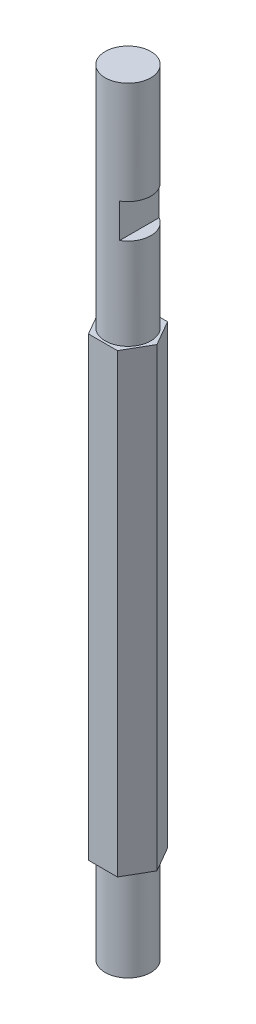
ISO-10303-21;
HEADER;
FILE_DESCRIPTION(('STEP AP214'),'2;1');
FILE_NAME('part.step','',(''),(''),'','','');
FILE_SCHEMA(('AUTOMOTIVE_DESIGN { 1 0 10303 214 1 1 1 1 }'));
ENDSEC;
DATA;
#1=APPLICATION_CONTEXT('core data for automotive mechanical design processes');
#2=APPLICATION_PROTOCOL_DEFINITION('international standard','automotive_design',2000,#1);
#3=PRODUCT_CONTEXT('',#1,'mechanical');
#4=PRODUCT('Part','Part','',(#3));
#5=PRODUCT_RELATED_PRODUCT_CATEGORY('part','',(#4));
#6=PRODUCT_DEFINITION_FORMATION('','',#4);
#7=PRODUCT_DEFINITION_CONTEXT('part definition',#1,'design');
#8=PRODUCT_DEFINITION('design','',#6,#7);
#9=PRODUCT_DEFINITION_SHAPE('','',#8);
#10=(LENGTH_UNIT() NAMED_UNIT(*) SI_UNIT(.MILLI.,.METRE.));
#11=(NAMED_UNIT(*) PLANE_ANGLE_UNIT() SI_UNIT($,.RADIAN.));
#12=(NAMED_UNIT(*) SI_UNIT($,.STERADIAN.) SOLID_ANGLE_UNIT());
#13=UNCERTAINTY_MEASURE_WITH_UNIT(LENGTH_MEASURE(1.E-05),#10,'distance_accuracy_value','');
#14=(GEOMETRIC_REPRESENTATION_CONTEXT(3) GLOBAL_UNCERTAINTY_ASSIGNED_CONTEXT((#13)) GLOBAL_UNIT_ASSIGNED_CONTEXT((#10,
#11,#12)) REPRESENTATION_CONTEXT('',''));
#15=CARTESIAN_POINT('',(0.,0.,0.));
#16=DIRECTION('',(0.,0.,1.));
#17=DIRECTION('',(1.,0.,0.));
#18=AXIS2_PLACEMENT_3D('',#15,#16,#17);
#19=CARTESIAN_POINT('',(0.,300.,0.));
#20=DIRECTION('',(0.,-1.,0.));
#21=DIRECTION('',(0.,0.,-1.));
#22=AXIS2_PLACEMENT_3D('',#19,#20,#21);
#23=CYLINDRICAL_SURFACE('',#22,10.);
#24=CARTESIAN_POINT('',(0.,200.,0.));
#25=DIRECTION('',(0.,1.,0.));
#26=DIRECTION('',(0.,0.,1.));
#27=AXIS2_PLACEMENT_3D('',#24,#25,#26);
#28=CIRCLE('',#27,10.);
#29=CARTESIAN_POINT('',(0.,200.,10.));
#30=VERTEX_POINT('',#29);
#31=EDGE_CURVE('E165',#30,#30,#28,.T.);
#32=ORIENTED_EDGE('',*,*,#31,.T.);
#33=EDGE_LOOP('',(#32));
#34=FACE_BOUND('',#33,.T.);
#35=CARTESIAN_POINT('',(0.,300.,0.));
#36=DIRECTION('',(0.,1.,0.));
#37=DIRECTION('',(0.,0.,1.));
#38=AXIS2_PLACEMENT_3D('',#35,#36,#37);
#39=CIRCLE('',#38,10.);
#40=CARTESIAN_POINT('',(0.,300.,10.));
#41=VERTEX_POINT('',#40);
#42=EDGE_CURVE('E164',#41,#41,#39,.T.);
#43=ORIENTED_EDGE('',*,*,#42,.F.);
#44=EDGE_LOOP('',(#43));
#45=FACE_BOUND('',#44,.T.);
#46=CARTESIAN_POINT('',(0.,255.,0.));
#47=DIRECTION('',(0.,-1.,0.));
#48=DIRECTION('',(0.,0.,-1.));
#49=AXIS2_PLACEMENT_3D('',#46,#47,#48);
#50=CIRCLE('',#49,10.);
#51=CARTESIAN_POINT('',(5.,255.,8.66025403784439));
#52=VERTEX_POINT('',#51);
#53=CARTESIAN_POINT('',(5.,255.,-8.66025403784439));
#54=VERTEX_POINT('',#53);
#55=EDGE_CURVE('E175',#52,#54,#50,.F.);
#56=ORIENTED_EDGE('',*,*,#55,.T.);
#57=DIRECTION('',(0.,-1.,0.));
#58=VECTOR('',#57,1.);
#59=CARTESIAN_POINT('',(5.,300.,-8.66025403784439));
#60=LINE('',#59,#58);
#61=CARTESIAN_POINT('',(5.,240.,-8.66025403784439));
#62=VERTEX_POINT('',#61);
#63=EDGE_CURVE('E182',#62,#54,#60,.F.);
#64=ORIENTED_EDGE('',*,*,#63,.F.);
#65=CARTESIAN_POINT('',(0.,240.,0.));
#66=DIRECTION('',(0.,1.,0.));
#67=DIRECTION('',(0.,0.,1.));
#68=AXIS2_PLACEMENT_3D('',#65,#66,#67);
#69=CIRCLE('',#68,10.);
#70=CARTESIAN_POINT('',(5.,240.,8.66025403784439));
#71=VERTEX_POINT('',#70);
#72=EDGE_CURVE('E179',#62,#71,#69,.F.);
#73=ORIENTED_EDGE('',*,*,#72,.T.);
#74=DIRECTION('',(0.,-1.,0.));
#75=VECTOR('',#74,1.);
#76=CARTESIAN_POINT('',(5.,300.,8.66025403784439));
#77=LINE('',#76,#75);
#78=EDGE_CURVE('E49',#71,#52,#77,.F.);
#79=ORIENTED_EDGE('',*,*,#78,.T.);
#80=EDGE_LOOP('',(#56,#64,#73,#79));
#81=FACE_BOUND('',#80,.T.);
#82=ADVANCED_FACE('F34',(#34,#45,#81),#23,.T.);
#83=CARTESIAN_POINT('',(6.35085296108589,200.,11.));
#84=DIRECTION('',(-0.866025403784439,0.,-0.5));
#85=DIRECTION('',(-0.5,0.,0.866025403784439));
#86=AXIS2_PLACEMENT_3D('',#83,#84,#85);
#87=PLANE('',#86);
#88=DIRECTION('',(0.5,0.,-0.866025403784439));
#89=VECTOR('',#88,1.);
#90=CARTESIAN_POINT('',(6.35085296108589,0.,11.));
#91=LINE('',#90,#89);
#92=CARTESIAN_POINT('',(6.35085296108589,0.,11.));
#93=VERTEX_POINT('',#92);
#94=CARTESIAN_POINT('',(12.7017059221718,0.,0.));
#95=VERTEX_POINT('',#94);
#96=EDGE_CURVE('E131',#93,#95,#91,.T.);
#97=ORIENTED_EDGE('',*,*,#96,.T.);
#98=DIRECTION('',(0.,-1.,0.));
#99=VECTOR('',#98,1.);
#100=CARTESIAN_POINT('',(12.7017059221718,200.,0.));
#101=LINE('',#100,#99);
#102=CARTESIAN_POINT('',(12.7017059221718,200.,0.));
#103=VERTEX_POINT('',#102);
#104=EDGE_CURVE('E42',#103,#95,#101,.T.);
#105=ORIENTED_EDGE('',*,*,#104,.F.);
#106=DIRECTION('',(0.5,0.,-0.866025403784439));
#107=VECTOR('',#106,1.);
#108=CARTESIAN_POINT('',(6.35085296108589,200.,11.));
#109=LINE('',#108,#107);
#110=CARTESIAN_POINT('',(6.35085296108589,200.,11.));
#111=VERTEX_POINT('',#110);
#112=EDGE_CURVE('E143',#111,#103,#109,.T.);
#113=ORIENTED_EDGE('',*,*,#112,.F.);
#114=DIRECTION('',(0.,-1.,0.));
#115=VECTOR('',#114,1.);
#116=CARTESIAN_POINT('',(6.35085296108589,200.,11.));
#117=LINE('',#116,#115);
#118=EDGE_CURVE('E127',#111,#93,#117,.T.);
#119=ORIENTED_EDGE('',*,*,#118,.T.);
#120=EDGE_LOOP('',(#97,#105,#113,#119));
#121=FACE_BOUND('',#120,.T.);
#122=ADVANCED_FACE('F36',(#121),#87,.F.);
#123=CARTESIAN_POINT('',(12.7017059221718,200.,0.));
#124=DIRECTION('',(-0.866025403784438,0.,0.5));
#125=DIRECTION('',(0.5,0.,0.866025403784439));
#126=AXIS2_PLACEMENT_3D('',#123,#124,#125);
#127=PLANE('',#126);
#128=DIRECTION('',(-0.5,0.,-0.866025403784438));
#129=VECTOR('',#128,1.);
#130=CARTESIAN_POINT('',(12.7017059221718,0.,0.));
#131=LINE('',#130,#129);
#132=CARTESIAN_POINT('',(6.35085296108588,0.,-11.));
#133=VERTEX_POINT('',#132);
#134=EDGE_CURVE('E134',#95,#133,#131,.T.);
#135=ORIENTED_EDGE('',*,*,#134,.T.);
#136=DIRECTION('',(0.,-1.,0.));
#137=VECTOR('',#136,1.);
#138=CARTESIAN_POINT('',(6.35085296108588,200.,-11.));
#139=LINE('',#138,#137);
#140=CARTESIAN_POINT('',(6.35085296108588,200.,-11.));
#141=VERTEX_POINT('',#140);
#142=EDGE_CURVE('E147',#141,#133,#139,.T.);
#143=ORIENTED_EDGE('',*,*,#142,.F.);
#144=DIRECTION('',(-0.5,0.,-0.866025403784438));
#145=VECTOR('',#144,1.);
#146=CARTESIAN_POINT('',(12.7017059221718,200.,0.));
#147=LINE('',#146,#145);
#148=EDGE_CURVE('E94',#103,#141,#147,.T.);
#149=ORIENTED_EDGE('',*,*,#148,.F.);
#150=ORIENTED_EDGE('',*,*,#104,.T.);
#151=EDGE_LOOP('',(#135,#143,#149,#150));
#152=FACE_BOUND('',#151,.T.);
#153=ADVANCED_FACE('F150',(#152),#127,.F.);
#154=CARTESIAN_POINT('',(6.35085296108588,200.,-11.));
#155=DIRECTION('',(0.,0.,1.));
#156=DIRECTION('',(1.,0.,0.));
#157=AXIS2_PLACEMENT_3D('',#154,#155,#156);
#158=PLANE('',#157);
#159=DIRECTION('',(-1.,0.,0.));
#160=VECTOR('',#159,1.);
#161=CARTESIAN_POINT('',(6.35085296108588,0.,-11.));
#162=LINE('',#161,#160);
#163=CARTESIAN_POINT('',(-6.35085296108588,0.,-11.));
#164=VERTEX_POINT('',#163);
#165=EDGE_CURVE('E137',#133,#164,#162,.T.);
#166=ORIENTED_EDGE('',*,*,#165,.T.);
#167=DIRECTION('',(0.,-1.,0.));
#168=VECTOR('',#167,1.);
#169=CARTESIAN_POINT('',(-6.35085296108588,200.,-11.));
#170=LINE('',#169,#168);
#171=CARTESIAN_POINT('',(-6.35085296108588,200.,-11.));
#172=VERTEX_POINT('',#171);
#173=EDGE_CURVE('E122',#172,#164,#170,.T.);
#174=ORIENTED_EDGE('',*,*,#173,.F.);
#175=DIRECTION('',(-1.,0.,0.));
#176=VECTOR('',#175,1.);
#177=CARTESIAN_POINT('',(6.35085296108588,200.,-11.));
#178=LINE('',#177,#176);
#179=EDGE_CURVE('E110',#141,#172,#178,.T.);
#180=ORIENTED_EDGE('',*,*,#179,.F.);
#181=ORIENTED_EDGE('',*,*,#142,.T.);
#182=EDGE_LOOP('',(#166,#174,#180,#181));
#183=FACE_BOUND('',#182,.T.);
#184=ADVANCED_FACE('F158',(#183),#158,.F.);
#185=CARTESIAN_POINT('',(-6.35085296108588,200.,-11.));
#186=DIRECTION('',(0.866025403784439,0.,0.5));
#187=DIRECTION('',(0.5,0.,-0.866025403784439));
#188=AXIS2_PLACEMENT_3D('',#185,#186,#187);
#189=PLANE('',#188);
#190=DIRECTION('',(-0.5,0.,0.866025403784439));
#191=VECTOR('',#190,1.);
#192=CARTESIAN_POINT('',(-6.35085296108588,0.,-11.));
#193=LINE('',#192,#191);
#194=CARTESIAN_POINT('',(-12.7017059221718,0.,0.));
#195=VERTEX_POINT('',#194);
#196=EDGE_CURVE('E119',#164,#195,#193,.T.);
#197=ORIENTED_EDGE('',*,*,#196,.T.);
#198=DIRECTION('',(0.,-1.,0.));
#199=VECTOR('',#198,1.);
#200=CARTESIAN_POINT('',(-12.7017059221718,200.,0.));
#201=LINE('',#200,#199);
#202=CARTESIAN_POINT('',(-12.7017059221718,200.,0.));
#203=VERTEX_POINT('',#202);
#204=EDGE_CURVE('E116',#203,#195,#201,.T.);
#205=ORIENTED_EDGE('',*,*,#204,.F.);
#206=DIRECTION('',(-0.5,0.,0.866025403784439));
#207=VECTOR('',#206,1.);
#208=CARTESIAN_POINT('',(-6.35085296108588,200.,-11.));
#209=LINE('',#208,#207);
#210=EDGE_CURVE('E103',#172,#203,#209,.T.);
#211=ORIENTED_EDGE('',*,*,#210,.F.);
#212=ORIENTED_EDGE('',*,*,#173,.T.);
#213=EDGE_LOOP('',(#197,#205,#211,#212));
#214=FACE_BOUND('',#213,.T.);
#215=ADVANCED_FACE('F117',(#214),#189,.F.);
#216=CARTESIAN_POINT('',(-12.7017059221718,200.,0.));
#217=DIRECTION('',(0.866025403784438,0.,-0.5));
#218=DIRECTION('',(-0.5,0.,-0.866025403784439));
#219=AXIS2_PLACEMENT_3D('',#216,#217,#218);
#220=PLANE('',#219);
#221=DIRECTION('',(0.5,0.,0.866025403784438));
#222=VECTOR('',#221,1.);
#223=CARTESIAN_POINT('',(-12.7017059221718,0.,0.));
#224=LINE('',#223,#222);
#225=CARTESIAN_POINT('',(-6.35085296108588,0.,11.));
#226=VERTEX_POINT('',#225);
#227=EDGE_CURVE('E140',#195,#226,#224,.T.);
#228=ORIENTED_EDGE('',*,*,#227,.T.);
#229=DIRECTION('',(0.,-1.,0.));
#230=VECTOR('',#229,1.);
#231=CARTESIAN_POINT('',(-6.35085296108588,200.,11.));
#232=LINE('',#231,#230);
#233=CARTESIAN_POINT('',(-6.35085296108588,200.,11.));
#234=VERTEX_POINT('',#233);
#235=EDGE_CURVE('E123',#234,#226,#232,.T.);
#236=ORIENTED_EDGE('',*,*,#235,.F.);
#237=DIRECTION('',(0.5,0.,0.866025403784438));
#238=VECTOR('',#237,1.);
#239=CARTESIAN_POINT('',(-12.7017059221718,200.,0.));
#240=LINE('',#239,#238);
#241=EDGE_CURVE('E107',#203,#234,#240,.T.);
#242=ORIENTED_EDGE('',*,*,#241,.F.);
#243=ORIENTED_EDGE('',*,*,#204,.T.);
#244=EDGE_LOOP('',(#228,#236,#242,#243));
#245=FACE_BOUND('',#244,.T.);
#246=ADVANCED_FACE('F125',(#245),#220,.F.);
#247=CARTESIAN_POINT('',(-6.35085296108588,200.,11.));
#248=DIRECTION('',(0.,0.,-1.));
#249=DIRECTION('',(-1.,0.,0.));
#250=AXIS2_PLACEMENT_3D('',#247,#248,#249);
#251=PLANE('',#250);
#252=DIRECTION('',(1.,0.,0.));
#253=VECTOR('',#252,1.);
#254=CARTESIAN_POINT('',(-6.35085296108588,0.,11.));
#255=LINE('',#254,#253);
#256=EDGE_CURVE('E85',#226,#93,#255,.T.);
#257=ORIENTED_EDGE('',*,*,#256,.T.);
#258=ORIENTED_EDGE('',*,*,#118,.F.);
#259=DIRECTION('',(1.,0.,0.));
#260=VECTOR('',#259,1.);
#261=CARTESIAN_POINT('',(-6.35085296108588,200.,11.));
#262=LINE('',#261,#260);
#263=EDGE_CURVE('E58',#234,#111,#262,.T.);
#264=ORIENTED_EDGE('',*,*,#263,.F.);
#265=ORIENTED_EDGE('',*,*,#235,.T.);
#266=EDGE_LOOP('',(#257,#258,#264,#265));
#267=FACE_BOUND('',#266,.T.);
#268=ADVANCED_FACE('F223',(#267),#251,.F.);
#269=CARTESIAN_POINT('',(0.,200.,0.));
#270=DIRECTION('',(0.,1.,0.));
#271=DIRECTION('',(0.,0.,1.));
#272=AXIS2_PLACEMENT_3D('',#269,#270,#271);
#273=PLANE('',#272);
#274=ORIENTED_EDGE('',*,*,#31,.F.);
#275=EDGE_LOOP('',(#274));
#276=FACE_BOUND('',#275,.T.);
#277=ORIENTED_EDGE('',*,*,#112,.T.);
#278=ORIENTED_EDGE('',*,*,#148,.T.);
#279=ORIENTED_EDGE('',*,*,#179,.T.);
#280=ORIENTED_EDGE('',*,*,#210,.T.);
#281=ORIENTED_EDGE('',*,*,#241,.T.);
#282=ORIENTED_EDGE('',*,*,#263,.T.);
#283=EDGE_LOOP('',(#277,#278,#279,#280,#281,#282));
#284=FACE_BOUND('',#283,.T.);
#285=ADVANCED_FACE('F105',(#276,#284),#273,.T.);
#286=CARTESIAN_POINT('',(0.,0.,0.));
#287=DIRECTION('',(0.,1.,0.));
#288=DIRECTION('',(0.,0.,1.));
#289=AXIS2_PLACEMENT_3D('',#286,#287,#288);
#290=PLANE('',#289);
#291=CARTESIAN_POINT('',(0.,0.,0.));
#292=DIRECTION('',(0.,1.,0.));
#293=DIRECTION('',(0.,0.,1.));
#294=AXIS2_PLACEMENT_3D('',#291,#292,#293);
#295=CIRCLE('',#294,10.);
#296=CARTESIAN_POINT('',(0.,0.,10.));
#297=VERTEX_POINT('',#296);
#298=EDGE_CURVE('E11',#297,#297,#295,.F.);
#299=ORIENTED_EDGE('',*,*,#298,.F.);
#300=EDGE_LOOP('',(#299));
#301=FACE_BOUND('',#300,.T.);
#302=ORIENTED_EDGE('',*,*,#96,.F.);
#303=ORIENTED_EDGE('',*,*,#256,.F.);
#304=ORIENTED_EDGE('',*,*,#227,.F.);
#305=ORIENTED_EDGE('',*,*,#196,.F.);
#306=ORIENTED_EDGE('',*,*,#165,.F.);
#307=ORIENTED_EDGE('',*,*,#134,.F.);
#308=EDGE_LOOP('',(#302,#303,#304,#305,#306,#307));
#309=FACE_BOUND('',#308,.T.);
#310=ADVANCED_FACE('F155',(#301,#309),#290,.F.);
#311=CARTESIAN_POINT('',(0.,-40.,0.));
#312=DIRECTION('',(0.,1.,0.));
#313=DIRECTION('',(0.,0.,1.));
#314=AXIS2_PLACEMENT_3D('',#311,#312,#313);
#315=CYLINDRICAL_SURFACE('',#314,10.);
#316=CARTESIAN_POINT('',(0.,-40.,0.));
#317=DIRECTION('',(0.,-1.,0.));
#318=DIRECTION('',(0.,0.,-1.));
#319=AXIS2_PLACEMENT_3D('',#316,#317,#318);
#320=CIRCLE('',#319,10.);
#321=CARTESIAN_POINT('',(0.,-40.,-10.));
#322=VERTEX_POINT('',#321);
#323=EDGE_CURVE('E135',#322,#322,#320,.T.);
#324=ORIENTED_EDGE('',*,*,#323,.F.);
#325=EDGE_LOOP('',(#324));
#326=FACE_BOUND('',#325,.T.);
#327=ORIENTED_EDGE('',*,*,#298,.T.);
#328=EDGE_LOOP('',(#327));
#329=FACE_BOUND('',#328,.T.);
#330=ADVANCED_FACE('F216',(#326,#329),#315,.T.);
#331=CARTESIAN_POINT('',(0.,-40.,0.));
#332=DIRECTION('',(0.,-1.,0.));
#333=DIRECTION('',(0.,0.,-1.));
#334=AXIS2_PLACEMENT_3D('',#331,#332,#333);
#335=PLANE('',#334);
#336=ORIENTED_EDGE('',*,*,#323,.T.);
#337=EDGE_LOOP('',(#336));
#338=FACE_BOUND('',#337,.T.);
#339=ADVANCED_FACE('F213',(#338),#335,.T.);
#340=CARTESIAN_POINT('',(0.,300.,0.));
#341=DIRECTION('',(0.,1.,0.));
#342=DIRECTION('',(0.,0.,1.));
#343=AXIS2_PLACEMENT_3D('',#340,#341,#342);
#344=PLANE('',#343);
#345=ORIENTED_EDGE('',*,*,#42,.T.);
#346=EDGE_LOOP('',(#345));
#347=FACE_BOUND('',#346,.T.);
#348=ADVANCED_FACE('F211',(#347),#344,.T.);
#349=CARTESIAN_POINT('',(5.,255.,11.001));
#350=DIRECTION('',(0.,-1.,0.));
#351=DIRECTION('',(0.,0.,-1.));
#352=AXIS2_PLACEMENT_3D('',#349,#350,#351);
#353=PLANE('',#352);
#354=DIRECTION('',(0.,0.,-1.));
#355=VECTOR('',#354,1.);
#356=CARTESIAN_POINT('',(5.,255.,11.001));
#357=LINE('',#356,#355);
#358=EDGE_CURVE('E168',#52,#54,#357,.T.);
#359=ORIENTED_EDGE('',*,*,#358,.T.);
#360=ORIENTED_EDGE('',*,*,#55,.F.);
#361=EDGE_LOOP('',(#359,#360));
#362=FACE_BOUND('',#361,.T.);
#363=ADVANCED_FACE('F192',(#362),#353,.T.);
#364=CARTESIAN_POINT('',(5.,240.,11.001));
#365=DIRECTION('',(1.,0.,0.));
#366=DIRECTION('',(0.,0.,-1.));
#367=AXIS2_PLACEMENT_3D('',#364,#365,#366);
#368=PLANE('',#367);
#369=DIRECTION('',(0.,0.,-1.));
#370=VECTOR('',#369,1.);
#371=CARTESIAN_POINT('',(5.,240.,11.001));
#372=LINE('',#371,#370);
#373=EDGE_CURVE('E173',#71,#62,#372,.T.);
#374=ORIENTED_EDGE('',*,*,#373,.T.);
#375=ORIENTED_EDGE('',*,*,#63,.T.);
#376=ORIENTED_EDGE('',*,*,#358,.F.);
#377=ORIENTED_EDGE('',*,*,#78,.F.);
#378=EDGE_LOOP('',(#374,#375,#376,#377));
#379=FACE_BOUND('',#378,.T.);
#380=ADVANCED_FACE('F186',(#379),#368,.T.);
#381=CARTESIAN_POINT('',(10.,240.,11.001));
#382=DIRECTION('',(0.,1.,0.));
#383=DIRECTION('',(0.,0.,1.));
#384=AXIS2_PLACEMENT_3D('',#381,#382,#383);
#385=PLANE('',#384);
#386=ORIENTED_EDGE('',*,*,#373,.F.);
#387=ORIENTED_EDGE('',*,*,#72,.F.);
#388=EDGE_LOOP('',(#386,#387));
#389=FACE_BOUND('',#388,.T.);
#390=ADVANCED_FACE('F195',(#389),#385,.T.);
#391=CLOSED_SHELL('',(#82,#122,#153,#184,#215,#246,#268,#285,#310,#330,#339,#348,#363,#380,#390));
#392=MANIFOLD_SOLID_BREP('B2',#391);
#393=ADVANCED_BREP_SHAPE_REPRESENTATION('',(#18,#392),#14);
#394=SHAPE_DEFINITION_REPRESENTATION(#9,#393);
ENDSEC;
END-ISO-10303-21;
